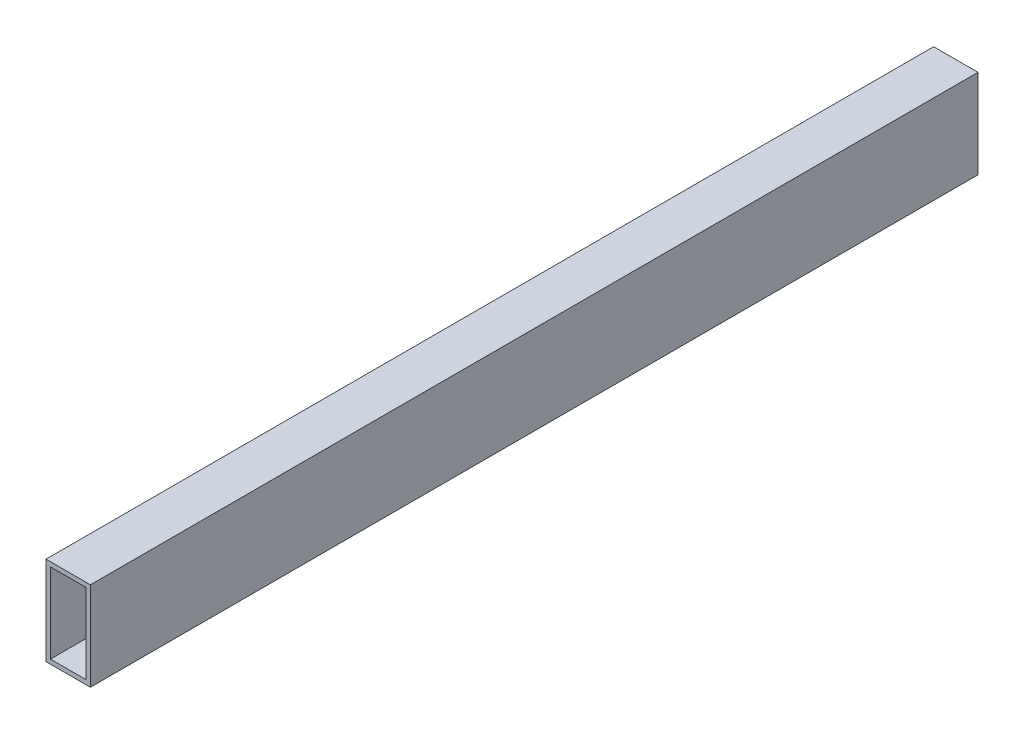
ISO-10303-21;
HEADER;
FILE_DESCRIPTION(('STEP AP214'),'2;1');
FILE_NAME('part.step','',(''),(''),'','','');
FILE_SCHEMA(('AUTOMOTIVE_DESIGN { 1 0 10303 214 1 1 1 1 }'));
ENDSEC;
DATA;
#1=APPLICATION_CONTEXT('core data for automotive mechanical design processes');
#2=APPLICATION_PROTOCOL_DEFINITION('international standard','automotive_design',2000,#1);
#3=PRODUCT_CONTEXT('',#1,'mechanical');
#4=PRODUCT('Part','Part','',(#3));
#5=PRODUCT_RELATED_PRODUCT_CATEGORY('part','',(#4));
#6=PRODUCT_DEFINITION_FORMATION('','',#4);
#7=PRODUCT_DEFINITION_CONTEXT('part definition',#1,'design');
#8=PRODUCT_DEFINITION('design','',#6,#7);
#9=PRODUCT_DEFINITION_SHAPE('','',#8);
#10=(LENGTH_UNIT() NAMED_UNIT(*) SI_UNIT(.MILLI.,.METRE.));
#11=(NAMED_UNIT(*) PLANE_ANGLE_UNIT() SI_UNIT($,.RADIAN.));
#12=(NAMED_UNIT(*) SI_UNIT($,.STERADIAN.) SOLID_ANGLE_UNIT());
#13=UNCERTAINTY_MEASURE_WITH_UNIT(LENGTH_MEASURE(1.E-05),#10,'distance_accuracy_value','');
#14=(GEOMETRIC_REPRESENTATION_CONTEXT(3) GLOBAL_UNCERTAINTY_ASSIGNED_CONTEXT((#13)) GLOBAL_UNIT_ASSIGNED_CONTEXT((#10,
#11,#12)) REPRESENTATION_CONTEXT('',''));
#15=CARTESIAN_POINT('',(0.,0.,0.));
#16=DIRECTION('',(0.,0.,1.));
#17=DIRECTION('',(1.,0.,0.));
#18=AXIS2_PLACEMENT_3D('',#15,#16,#17);
#19=CARTESIAN_POINT('',(0.,0.,500.));
#20=DIRECTION('',(0.,0.,1.));
#21=DIRECTION('',(1.,0.,0.));
#22=AXIS2_PLACEMENT_3D('',#19,#20,#21);
#23=PLANE('',#22);
#24=DIRECTION('',(0.,1.,0.));
#25=VECTOR('',#24,1.);
#26=CARTESIAN_POINT('',(12.5,25.,500.));
#27=LINE('',#26,#25);
#28=CARTESIAN_POINT('',(12.5,-25.,500.));
#29=VERTEX_POINT('',#28);
#30=CARTESIAN_POINT('',(12.5,25.,500.));
#31=VERTEX_POINT('',#30);
#32=EDGE_CURVE('E134',#29,#31,#27,.T.);
#33=ORIENTED_EDGE('',*,*,#32,.T.);
#34=DIRECTION('',(-1.,0.,0.));
#35=VECTOR('',#34,1.);
#36=CARTESIAN_POINT('',(-12.5,25.,500.));
#37=LINE('',#36,#35);
#38=CARTESIAN_POINT('',(-12.5,25.,500.));
#39=VERTEX_POINT('',#38);
#40=EDGE_CURVE('E137',#31,#39,#37,.T.);
#41=ORIENTED_EDGE('',*,*,#40,.T.);
#42=DIRECTION('',(0.,-1.,0.));
#43=VECTOR('',#42,1.);
#44=CARTESIAN_POINT('',(-12.5,25.,500.));
#45=LINE('',#44,#43);
#46=CARTESIAN_POINT('',(-12.5,-25.,500.));
#47=VERTEX_POINT('',#46);
#48=EDGE_CURVE('E140',#39,#47,#45,.T.);
#49=ORIENTED_EDGE('',*,*,#48,.T.);
#50=DIRECTION('',(1.,0.,0.));
#51=VECTOR('',#50,1.);
#52=CARTESIAN_POINT('',(-12.5,-25.,500.));
#53=LINE('',#52,#51);
#54=EDGE_CURVE('E142',#47,#29,#53,.T.);
#55=ORIENTED_EDGE('',*,*,#54,.T.);
#56=EDGE_LOOP('',(#33,#41,#49,#55));
#57=FACE_BOUND('',#56,.T.);
#58=DIRECTION('',(-1.,0.,0.));
#59=VECTOR('',#58,1.);
#60=CARTESIAN_POINT('',(-10.,22.5,500.));
#61=LINE('',#60,#59);
#62=CARTESIAN_POINT('',(10.,22.5,500.));
#63=VERTEX_POINT('',#62);
#64=CARTESIAN_POINT('',(-10.,22.5,500.));
#65=VERTEX_POINT('',#64);
#66=EDGE_CURVE('E106',#63,#65,#61,.T.);
#67=ORIENTED_EDGE('',*,*,#66,.F.);
#68=DIRECTION('',(0.,1.,0.));
#69=VECTOR('',#68,1.);
#70=CARTESIAN_POINT('',(10.,22.5,500.));
#71=LINE('',#70,#69);
#72=CARTESIAN_POINT('',(10.,-22.5,500.));
#73=VERTEX_POINT('',#72);
#74=EDGE_CURVE('E98',#73,#63,#71,.T.);
#75=ORIENTED_EDGE('',*,*,#74,.F.);
#76=DIRECTION('',(1.,0.,0.));
#77=VECTOR('',#76,1.);
#78=CARTESIAN_POINT('',(-10.,-22.5,500.));
#79=LINE('',#78,#77);
#80=CARTESIAN_POINT('',(-10.,-22.5,500.));
#81=VERTEX_POINT('',#80);
#82=EDGE_CURVE('E120',#81,#73,#79,.T.);
#83=ORIENTED_EDGE('',*,*,#82,.F.);
#84=DIRECTION('',(0.,-1.,0.));
#85=VECTOR('',#84,1.);
#86=CARTESIAN_POINT('',(-10.,22.5,500.));
#87=LINE('',#86,#85);
#88=EDGE_CURVE('E118',#65,#81,#87,.T.);
#89=ORIENTED_EDGE('',*,*,#88,.F.);
#90=EDGE_LOOP('',(#67,#75,#83,#89));
#91=FACE_BOUND('',#90,.T.);
#92=ADVANCED_FACE('F33',(#57,#91),#23,.T.);
#93=CARTESIAN_POINT('',(0.,0.,0.));
#94=DIRECTION('',(0.,0.,1.));
#95=DIRECTION('',(1.,0.,0.));
#96=AXIS2_PLACEMENT_3D('',#93,#94,#95);
#97=PLANE('',#96);
#98=DIRECTION('',(0.,1.,0.));
#99=VECTOR('',#98,1.);
#100=CARTESIAN_POINT('',(12.5,25.,0.));
#101=LINE('',#100,#99);
#102=CARTESIAN_POINT('',(12.5,-25.,0.));
#103=VERTEX_POINT('',#102);
#104=CARTESIAN_POINT('',(12.5,25.,0.));
#105=VERTEX_POINT('',#104);
#106=EDGE_CURVE('E114',#103,#105,#101,.T.);
#107=ORIENTED_EDGE('',*,*,#106,.F.);
#108=DIRECTION('',(1.,0.,0.));
#109=VECTOR('',#108,1.);
#110=CARTESIAN_POINT('',(-12.5,-25.,0.));
#111=LINE('',#110,#109);
#112=CARTESIAN_POINT('',(-12.5,-25.,0.));
#113=VERTEX_POINT('',#112);
#114=EDGE_CURVE('E138',#113,#103,#111,.T.);
#115=ORIENTED_EDGE('',*,*,#114,.F.);
#116=DIRECTION('',(0.,-1.,0.));
#117=VECTOR('',#116,1.);
#118=CARTESIAN_POINT('',(-12.5,25.,0.));
#119=LINE('',#118,#117);
#120=CARTESIAN_POINT('',(-12.5,25.,0.));
#121=VERTEX_POINT('',#120);
#122=EDGE_CURVE('E149',#121,#113,#119,.T.);
#123=ORIENTED_EDGE('',*,*,#122,.F.);
#124=DIRECTION('',(-1.,0.,0.));
#125=VECTOR('',#124,1.);
#126=CARTESIAN_POINT('',(-12.5,25.,0.));
#127=LINE('',#126,#125);
#128=EDGE_CURVE('E147',#105,#121,#127,.T.);
#129=ORIENTED_EDGE('',*,*,#128,.F.);
#130=EDGE_LOOP('',(#107,#115,#123,#129));
#131=FACE_BOUND('',#130,.T.);
#132=DIRECTION('',(0.,1.,0.));
#133=VECTOR('',#132,1.);
#134=CARTESIAN_POINT('',(10.,22.5,0.));
#135=LINE('',#134,#133);
#136=CARTESIAN_POINT('',(10.,-22.5,0.));
#137=VERTEX_POINT('',#136);
#138=CARTESIAN_POINT('',(10.,22.5,0.));
#139=VERTEX_POINT('',#138);
#140=EDGE_CURVE('E56',#137,#139,#135,.T.);
#141=ORIENTED_EDGE('',*,*,#140,.T.);
#142=DIRECTION('',(-1.,0.,0.));
#143=VECTOR('',#142,1.);
#144=CARTESIAN_POINT('',(-10.,22.5,0.));
#145=LINE('',#144,#143);
#146=CARTESIAN_POINT('',(-10.,22.5,0.));
#147=VERTEX_POINT('',#146);
#148=EDGE_CURVE('E113',#139,#147,#145,.T.);
#149=ORIENTED_EDGE('',*,*,#148,.T.);
#150=DIRECTION('',(0.,-1.,0.));
#151=VECTOR('',#150,1.);
#152=CARTESIAN_POINT('',(-10.,22.5,0.));
#153=LINE('',#152,#151);
#154=CARTESIAN_POINT('',(-10.,-22.5,0.));
#155=VERTEX_POINT('',#154);
#156=EDGE_CURVE('E126',#147,#155,#153,.T.);
#157=ORIENTED_EDGE('',*,*,#156,.T.);
#158=DIRECTION('',(1.,0.,0.));
#159=VECTOR('',#158,1.);
#160=CARTESIAN_POINT('',(-10.,-22.5,0.));
#161=LINE('',#160,#159);
#162=EDGE_CURVE('E107',#155,#137,#161,.T.);
#163=ORIENTED_EDGE('',*,*,#162,.T.);
#164=EDGE_LOOP('',(#141,#149,#157,#163));
#165=FACE_BOUND('',#164,.T.);
#166=ADVANCED_FACE('F167',(#131,#165),#97,.F.);
#167=CARTESIAN_POINT('',(12.5,25.,500.));
#168=DIRECTION('',(-1.,0.,0.));
#169=DIRECTION('',(0.,-1.,0.));
#170=AXIS2_PLACEMENT_3D('',#167,#168,#169);
#171=PLANE('',#170);
#172=ORIENTED_EDGE('',*,*,#106,.T.);
#173=DIRECTION('',(0.,0.,-1.));
#174=VECTOR('',#173,1.);
#175=CARTESIAN_POINT('',(12.5,25.,500.));
#176=LINE('',#175,#174);
#177=EDGE_CURVE('E11',#31,#105,#176,.T.);
#178=ORIENTED_EDGE('',*,*,#177,.F.);
#179=ORIENTED_EDGE('',*,*,#32,.F.);
#180=DIRECTION('',(0.,0.,-1.));
#181=VECTOR('',#180,1.);
#182=CARTESIAN_POINT('',(12.5,-25.,500.));
#183=LINE('',#182,#181);
#184=EDGE_CURVE('E144',#29,#103,#183,.T.);
#185=ORIENTED_EDGE('',*,*,#184,.T.);
#186=EDGE_LOOP('',(#172,#178,#179,#185));
#187=FACE_BOUND('',#186,.T.);
#188=ADVANCED_FACE('F35',(#187),#171,.F.);
#189=CARTESIAN_POINT('',(-12.5,25.,500.));
#190=DIRECTION('',(0.,-1.,0.));
#191=DIRECTION('',(0.,0.,-1.));
#192=AXIS2_PLACEMENT_3D('',#189,#190,#191);
#193=PLANE('',#192);
#194=ORIENTED_EDGE('',*,*,#128,.T.);
#195=DIRECTION('',(0.,0.,-1.));
#196=VECTOR('',#195,1.);
#197=CARTESIAN_POINT('',(-12.5,25.,500.));
#198=LINE('',#197,#196);
#199=EDGE_CURVE('E41',#39,#121,#198,.T.);
#200=ORIENTED_EDGE('',*,*,#199,.F.);
#201=ORIENTED_EDGE('',*,*,#40,.F.);
#202=ORIENTED_EDGE('',*,*,#177,.T.);
#203=EDGE_LOOP('',(#194,#200,#201,#202));
#204=FACE_BOUND('',#203,.T.);
#205=ADVANCED_FACE('F177',(#204),#193,.F.);
#206=CARTESIAN_POINT('',(-12.5,25.,500.));
#207=DIRECTION('',(1.,0.,0.));
#208=DIRECTION('',(0.,1.,0.));
#209=AXIS2_PLACEMENT_3D('',#206,#207,#208);
#210=PLANE('',#209);
#211=ORIENTED_EDGE('',*,*,#122,.T.);
#212=DIRECTION('',(0.,0.,-1.));
#213=VECTOR('',#212,1.);
#214=CARTESIAN_POINT('',(-12.5,-25.,500.));
#215=LINE('',#214,#213);
#216=EDGE_CURVE('E154',#47,#113,#215,.T.);
#217=ORIENTED_EDGE('',*,*,#216,.F.);
#218=ORIENTED_EDGE('',*,*,#48,.F.);
#219=ORIENTED_EDGE('',*,*,#199,.T.);
#220=EDGE_LOOP('',(#211,#217,#218,#219));
#221=FACE_BOUND('',#220,.T.);
#222=ADVANCED_FACE('F161',(#221),#210,.F.);
#223=CARTESIAN_POINT('',(-12.5,-25.,500.));
#224=DIRECTION('',(0.,1.,0.));
#225=DIRECTION('',(0.,0.,1.));
#226=AXIS2_PLACEMENT_3D('',#223,#224,#225);
#227=PLANE('',#226);
#228=ORIENTED_EDGE('',*,*,#114,.T.);
#229=ORIENTED_EDGE('',*,*,#184,.F.);
#230=ORIENTED_EDGE('',*,*,#54,.F.);
#231=ORIENTED_EDGE('',*,*,#216,.T.);
#232=EDGE_LOOP('',(#228,#229,#230,#231));
#233=FACE_BOUND('',#232,.T.);
#234=ADVANCED_FACE('F171',(#233),#227,.F.);
#235=CARTESIAN_POINT('',(10.,22.5,500.));
#236=DIRECTION('',(-1.,0.,0.));
#237=DIRECTION('',(0.,0.,1.));
#238=AXIS2_PLACEMENT_3D('',#235,#236,#237);
#239=PLANE('',#238);
#240=ORIENTED_EDGE('',*,*,#140,.F.);
#241=DIRECTION('',(0.,0.,-1.));
#242=VECTOR('',#241,1.);
#243=CARTESIAN_POINT('',(10.,-22.5,500.));
#244=LINE('',#243,#242);
#245=EDGE_CURVE('E102',#73,#137,#244,.T.);
#246=ORIENTED_EDGE('',*,*,#245,.F.);
#247=ORIENTED_EDGE('',*,*,#74,.T.);
#248=DIRECTION('',(0.,0.,-1.));
#249=VECTOR('',#248,1.);
#250=CARTESIAN_POINT('',(10.,22.5,500.));
#251=LINE('',#250,#249);
#252=EDGE_CURVE('E101',#63,#139,#251,.T.);
#253=ORIENTED_EDGE('',*,*,#252,.T.);
#254=EDGE_LOOP('',(#240,#246,#247,#253));
#255=FACE_BOUND('',#254,.T.);
#256=ADVANCED_FACE('F100',(#255),#239,.T.);
#257=CARTESIAN_POINT('',(-10.,22.5,500.));
#258=DIRECTION('',(0.,-1.,0.));
#259=DIRECTION('',(0.,0.,-1.));
#260=AXIS2_PLACEMENT_3D('',#257,#258,#259);
#261=PLANE('',#260);
#262=ORIENTED_EDGE('',*,*,#148,.F.);
#263=ORIENTED_EDGE('',*,*,#252,.F.);
#264=ORIENTED_EDGE('',*,*,#66,.T.);
#265=DIRECTION('',(0.,0.,-1.));
#266=VECTOR('',#265,1.);
#267=CARTESIAN_POINT('',(-10.,22.5,500.));
#268=LINE('',#267,#266);
#269=EDGE_CURVE('E115',#65,#147,#268,.T.);
#270=ORIENTED_EDGE('',*,*,#269,.T.);
#271=EDGE_LOOP('',(#262,#263,#264,#270));
#272=FACE_BOUND('',#271,.T.);
#273=ADVANCED_FACE('F110',(#272),#261,.T.);
#274=CARTESIAN_POINT('',(-10.,22.5,500.));
#275=DIRECTION('',(1.,0.,0.));
#276=DIRECTION('',(0.,0.,-1.));
#277=AXIS2_PLACEMENT_3D('',#274,#275,#276);
#278=PLANE('',#277);
#279=ORIENTED_EDGE('',*,*,#156,.F.);
#280=ORIENTED_EDGE('',*,*,#269,.F.);
#281=ORIENTED_EDGE('',*,*,#88,.T.);
#282=DIRECTION('',(0.,0.,-1.));
#283=VECTOR('',#282,1.);
#284=CARTESIAN_POINT('',(-10.,-22.5,500.));
#285=LINE('',#284,#283);
#286=EDGE_CURVE('E48',#81,#155,#285,.T.);
#287=ORIENTED_EDGE('',*,*,#286,.T.);
#288=EDGE_LOOP('',(#279,#280,#281,#287));
#289=FACE_BOUND('',#288,.T.);
#290=ADVANCED_FACE('F200',(#289),#278,.T.);
#291=CARTESIAN_POINT('',(-10.,-22.5,500.));
#292=DIRECTION('',(0.,1.,0.));
#293=DIRECTION('',(0.,0.,1.));
#294=AXIS2_PLACEMENT_3D('',#291,#292,#293);
#295=PLANE('',#294);
#296=ORIENTED_EDGE('',*,*,#162,.F.);
#297=ORIENTED_EDGE('',*,*,#286,.F.);
#298=ORIENTED_EDGE('',*,*,#82,.T.);
#299=ORIENTED_EDGE('',*,*,#245,.T.);
#300=EDGE_LOOP('',(#296,#297,#298,#299));
#301=FACE_BOUND('',#300,.T.);
#302=ADVANCED_FACE('F204',(#301),#295,.T.);
#303=CLOSED_SHELL('',(#92,#166,#188,#205,#222,#234,#256,#273,#290,#302));
#304=MANIFOLD_SOLID_BREP('B2',#303);
#305=ADVANCED_BREP_SHAPE_REPRESENTATION('',(#18,#304),#14);
#306=SHAPE_DEFINITION_REPRESENTATION(#9,#305);
ENDSEC;
END-ISO-10303-21;
